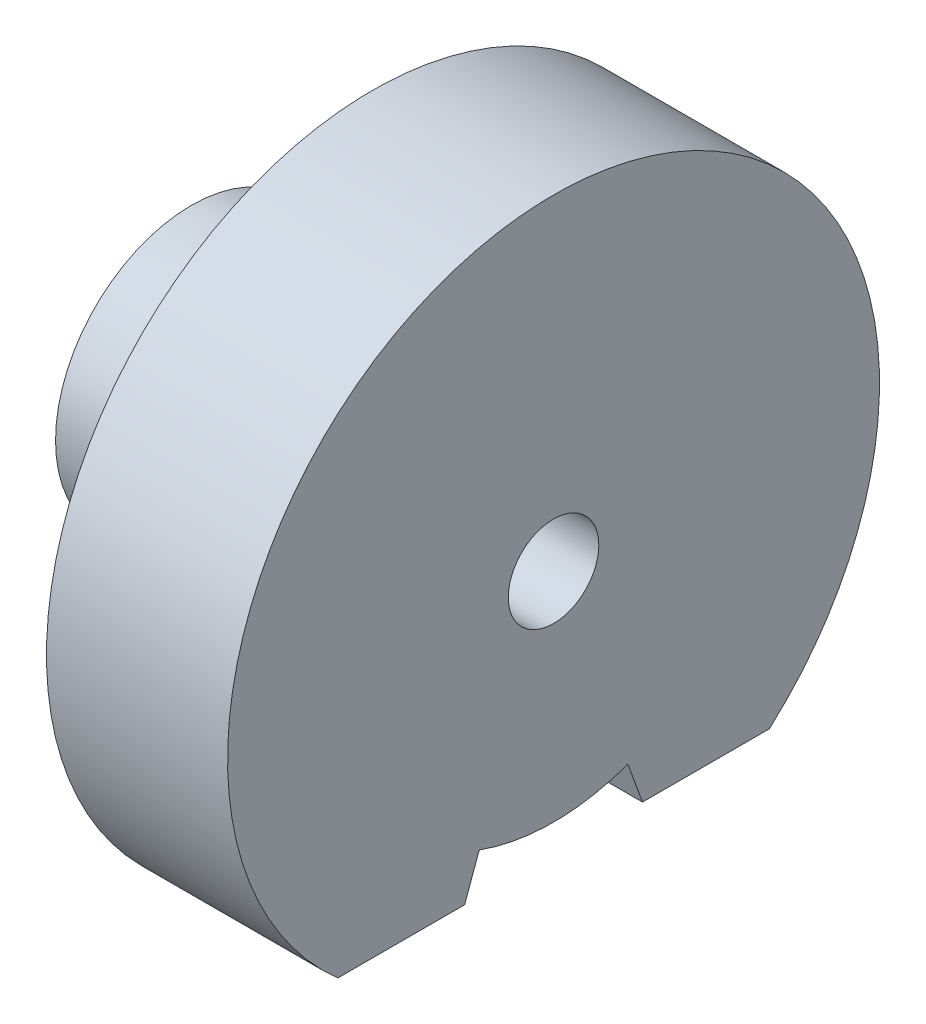
ISO-10303-21;
HEADER;
FILE_DESCRIPTION(('STEP AP214'),'2;1');
FILE_NAME('part.step','',(''),(''),'','','');
FILE_SCHEMA(('AUTOMOTIVE_DESIGN { 1 0 10303 214 1 1 1 1 }'));
ENDSEC;
DATA;
#1=APPLICATION_CONTEXT('core data for automotive mechanical design processes');
#2=APPLICATION_PROTOCOL_DEFINITION('international standard','automotive_design',2000,#1);
#3=PRODUCT_CONTEXT('',#1,'mechanical');
#4=PRODUCT('Part','Part','',(#3));
#5=PRODUCT_RELATED_PRODUCT_CATEGORY('part','',(#4));
#6=PRODUCT_DEFINITION_FORMATION('','',#4);
#7=PRODUCT_DEFINITION_CONTEXT('part definition',#1,'design');
#8=PRODUCT_DEFINITION('design','',#6,#7);
#9=PRODUCT_DEFINITION_SHAPE('','',#8);
#10=(LENGTH_UNIT() NAMED_UNIT(*) SI_UNIT(.MILLI.,.METRE.));
#11=(NAMED_UNIT(*) PLANE_ANGLE_UNIT() SI_UNIT($,.RADIAN.));
#12=(NAMED_UNIT(*) SI_UNIT($,.STERADIAN.) SOLID_ANGLE_UNIT());
#13=UNCERTAINTY_MEASURE_WITH_UNIT(LENGTH_MEASURE(1.E-05),#10,'distance_accuracy_value','');
#14=(GEOMETRIC_REPRESENTATION_CONTEXT(3) GLOBAL_UNCERTAINTY_ASSIGNED_CONTEXT((#13)) GLOBAL_UNIT_ASSIGNED_CONTEXT((#10,
#11,#12)) REPRESENTATION_CONTEXT('',''));
#15=CARTESIAN_POINT('',(0.,0.,0.));
#16=DIRECTION('',(0.,0.,1.));
#17=DIRECTION('',(1.,0.,0.));
#18=AXIS2_PLACEMENT_3D('',#15,#16,#17);
#19=CARTESIAN_POINT('',(-5.,0.,0.));
#20=DIRECTION('',(-1.,0.,0.));
#21=DIRECTION('',(0.,-1.,0.));
#22=AXIS2_PLACEMENT_3D('',#19,#20,#21);
#23=PLANE('',#22);
#24=CARTESIAN_POINT('',(-4.99999999999999,-12.,0.));
#25=DIRECTION('',(-1.,0.,0.));
#26=DIRECTION('',(0.,-1.,0.));
#27=AXIS2_PLACEMENT_3D('',#24,#25,#26);
#28=CIRCLE('',#27,9.5);
#29=CARTESIAN_POINT('',(-4.99999999999999,-21.5,0.));
#30=VERTEX_POINT('',#29);
#31=EDGE_CURVE('E11',#30,#30,#28,.F.);
#32=ORIENTED_EDGE('',*,*,#31,.T.);
#33=EDGE_LOOP('',(#32));
#34=FACE_BOUND('',#33,.T.);
#35=DIRECTION('',(0.,-0.939692620785911,0.342020143325661));
#36=VECTOR('',#35,1.);
#37=CARTESIAN_POINT('',(-5.,-23.276311449431,4.10424171990794));
#38=LINE('',#37,#36);
#39=CARTESIAN_POINT('',(-5.,-23.2763114494309,4.10424171990793));
#40=VERTEX_POINT('',#39);
#41=CARTESIAN_POINT('',(-4.99999999999999,-25.4942657408898,4.91151106296191));
#42=VERTEX_POINT('',#41);
#43=EDGE_CURVE('E123',#40,#42,#38,.T.);
#44=ORIENTED_EDGE('',*,*,#43,.T.);
#45=DIRECTION('',(0.,0.,-1.));
#46=VECTOR('',#45,1.);
#47=CARTESIAN_POINT('',(-4.99999999999999,-25.4942657408898,1.389771851223E-13));
#48=LINE('',#47,#46);
#49=CARTESIAN_POINT('',(-4.99999999999998,-25.4942657408897,11.912379783832));
#50=VERTEX_POINT('',#49);
#51=EDGE_CURVE('E167',#42,#50,#48,.F.);
#52=ORIENTED_EDGE('',*,*,#51,.T.);
#53=CARTESIAN_POINT('',(-4.99999999999998,-12.,0.));
#54=DIRECTION('',(1.,0.,0.));
#55=DIRECTION('',(0.,1.,0.));
#56=AXIS2_PLACEMENT_3D('',#53,#54,#55);
#57=CIRCLE('',#56,18.);
#58=CARTESIAN_POINT('',(-4.99999999999998,-25.4942657408898,-11.912379783832));
#59=VERTEX_POINT('',#58);
#60=EDGE_CURVE('E143',#59,#50,#57,.T.);
#61=ORIENTED_EDGE('',*,*,#60,.F.);
#62=DIRECTION('',(0.,0.,-1.));
#63=VECTOR('',#62,1.);
#64=CARTESIAN_POINT('',(-4.99999999999999,-25.4942657408898,-1.389771851223E-13));
#65=LINE('',#64,#63);
#66=CARTESIAN_POINT('',(-4.99999999999999,-25.4942657408898,-4.91151106296191));
#67=VERTEX_POINT('',#66);
#68=EDGE_CURVE('E160',#59,#67,#65,.F.);
#69=ORIENTED_EDGE('',*,*,#68,.T.);
#70=DIRECTION('',(0.,-0.939692620785911,-0.342020143325661));
#71=VECTOR('',#70,1.);
#72=CARTESIAN_POINT('',(-5.,-23.276311449431,-4.10424171990794));
#73=LINE('',#72,#71);
#74=CARTESIAN_POINT('',(-5.,-23.2763114494309,-4.10424171990793));
#75=VERTEX_POINT('',#74);
#76=EDGE_CURVE('E137',#75,#67,#73,.T.);
#77=ORIENTED_EDGE('',*,*,#76,.F.);
#78=CARTESIAN_POINT('',(-5.,-12.,0.));
#79=DIRECTION('',(1.,0.,0.));
#80=DIRECTION('',(0.,1.,0.));
#81=AXIS2_PLACEMENT_3D('',#78,#79,#80);
#82=CIRCLE('',#81,12.);
#83=EDGE_CURVE('E112',#40,#75,#82,.T.);
#84=ORIENTED_EDGE('',*,*,#83,.F.);
#85=EDGE_LOOP('',(#44,#52,#61,#69,#77,#84));
#86=FACE_BOUND('',#85,.T.);
#87=ADVANCED_FACE('F37',(#34,#86),#23,.T.);
#88=CARTESIAN_POINT('',(5.00000000000001,-12.,0.));
#89=DIRECTION('',(1.,0.,0.));
#90=DIRECTION('',(0.,1.,0.));
#91=AXIS2_PLACEMENT_3D('',#88,#89,#90);
#92=CYLINDRICAL_SURFACE('',#91,12.);
#93=ORIENTED_EDGE('',*,*,#83,.T.);
#94=DIRECTION('',(-1.,0.,0.));
#95=VECTOR('',#94,1.);
#96=CARTESIAN_POINT('',(0.,-23.2763114494309,-4.10424171990793));
#97=LINE('',#96,#95);
#98=CARTESIAN_POINT('',(-1.99999999999999,-23.2763114494309,-4.10424171990793));
#99=VERTEX_POINT('',#98);
#100=EDGE_CURVE('E140',#99,#75,#97,.T.);
#101=ORIENTED_EDGE('',*,*,#100,.F.);
#102=CARTESIAN_POINT('',(-2.,-12.,0.));
#103=DIRECTION('',(1.,0.,0.));
#104=DIRECTION('',(0.,1.,0.));
#105=AXIS2_PLACEMENT_3D('',#102,#103,#104);
#106=CIRCLE('',#105,12.);
#107=CARTESIAN_POINT('',(-1.99999999999999,-23.2763114494309,4.10424171990793));
#108=VERTEX_POINT('',#107);
#109=EDGE_CURVE('E150',#108,#99,#106,.T.);
#110=ORIENTED_EDGE('',*,*,#109,.F.);
#111=DIRECTION('',(-1.,0.,0.));
#112=VECTOR('',#111,1.);
#113=CARTESIAN_POINT('',(0.,-23.2763114494309,4.10424171990793));
#114=LINE('',#113,#112);
#115=EDGE_CURVE('E125',#108,#40,#114,.T.);
#116=ORIENTED_EDGE('',*,*,#115,.T.);
#117=EDGE_LOOP('',(#93,#101,#110,#116));
#118=FACE_BOUND('',#117,.T.);
#119=ADVANCED_FACE('F183',(#118),#92,.T.);
#120=CARTESIAN_POINT('',(5.00000000000001,-12.,0.));
#121=DIRECTION('',(1.,0.,0.));
#122=DIRECTION('',(0.,1.,0.));
#123=AXIS2_PLACEMENT_3D('',#120,#121,#122);
#124=CYLINDRICAL_SURFACE('',#123,12.);
#125=CARTESIAN_POINT('',(2.,-12.,0.));
#126=DIRECTION('',(1.,0.,0.));
#127=DIRECTION('',(0.,1.,0.));
#128=AXIS2_PLACEMENT_3D('',#125,#126,#127);
#129=CIRCLE('',#128,12.);
#130=CARTESIAN_POINT('',(2.00000000000001,-23.2763114494309,4.10424171990793));
#131=VERTEX_POINT('',#130);
#132=CARTESIAN_POINT('',(2.00000000000001,-23.2763114494309,-4.10424171990793));
#133=VERTEX_POINT('',#132);
#134=EDGE_CURVE('E113',#131,#133,#129,.T.);
#135=ORIENTED_EDGE('',*,*,#134,.T.);
#136=DIRECTION('',(-1.,0.,0.));
#137=VECTOR('',#136,1.);
#138=CARTESIAN_POINT('',(0.,-23.2763114494309,-4.10424171990793));
#139=LINE('',#138,#137);
#140=CARTESIAN_POINT('',(5.00000000000001,-23.2763114494309,-4.10424171990793));
#141=VERTEX_POINT('',#140);
#142=EDGE_CURVE('E109',#141,#133,#139,.T.);
#143=ORIENTED_EDGE('',*,*,#142,.F.);
#144=CARTESIAN_POINT('',(5.00000000000001,-12.,0.));
#145=DIRECTION('',(1.,0.,0.));
#146=DIRECTION('',(0.,1.,0.));
#147=AXIS2_PLACEMENT_3D('',#144,#145,#146);
#148=CIRCLE('',#147,12.);
#149=CARTESIAN_POINT('',(5.00000000000001,-23.2763114494309,4.10424171990793));
#150=VERTEX_POINT('',#149);
#151=EDGE_CURVE('E103',#150,#141,#148,.T.);
#152=ORIENTED_EDGE('',*,*,#151,.F.);
#153=DIRECTION('',(-1.,0.,0.));
#154=VECTOR('',#153,1.);
#155=CARTESIAN_POINT('',(0.,-23.2763114494309,4.10424171990793));
#156=LINE('',#155,#154);
#157=EDGE_CURVE('E106',#150,#131,#156,.T.);
#158=ORIENTED_EDGE('',*,*,#157,.T.);
#159=EDGE_LOOP('',(#135,#143,#152,#158));
#160=FACE_BOUND('',#159,.T.);
#161=ADVANCED_FACE('F105',(#160),#124,.T.);
#162=CARTESIAN_POINT('',(0.,-12.,0.));
#163=DIRECTION('',(1.,0.,0.));
#164=DIRECTION('',(0.,1.,0.));
#165=AXIS2_PLACEMENT_3D('',#162,#163,#164);
#166=TOROIDAL_SURFACE('',#165,12.,2.);
#167=ORIENTED_EDGE('',*,*,#109,.T.);
#168=CARTESIAN_POINT('',(0.,-23.2763114494309,-4.10424171990793));
#169=DIRECTION('',(0.,0.342020143325661,-0.939692620785911));
#170=DIRECTION('',(1.,0.,0.));
#171=AXIS2_PLACEMENT_3D('',#168,#169,#170);
#172=CIRCLE('',#171,2.);
#173=EDGE_CURVE('E131',#133,#99,#172,.T.);
#174=ORIENTED_EDGE('',*,*,#173,.F.);
#175=ORIENTED_EDGE('',*,*,#134,.F.);
#176=CARTESIAN_POINT('',(0.,-23.2763114494309,4.10424171990793));
#177=DIRECTION('',(0.,-0.342020143325661,-0.939692620785911));
#178=DIRECTION('',(1.,0.,0.));
#179=AXIS2_PLACEMENT_3D('',#176,#177,#178);
#180=CIRCLE('',#179,2.);
#181=EDGE_CURVE('E120',#131,#108,#180,.T.);
#182=ORIENTED_EDGE('',*,*,#181,.T.);
#183=EDGE_LOOP('',(#167,#174,#175,#182));
#184=FACE_BOUND('',#183,.T.);
#185=ADVANCED_FACE('F195',(#184),#166,.F.);
#186=CARTESIAN_POINT('',(5.00000000000001,0.,0.));
#187=DIRECTION('',(-1.,0.,0.));
#188=DIRECTION('',(0.,-1.,0.));
#189=AXIS2_PLACEMENT_3D('',#186,#187,#188);
#190=PLANE('',#189);
#191=CARTESIAN_POINT('',(5.00000000000001,-12.,0.));
#192=DIRECTION('',(1.,0.,0.));
#193=DIRECTION('',(0.,0.,-1.));
#194=AXIS2_PLACEMENT_3D('',#191,#192,#193);
#195=CIRCLE('',#194,2.5);
#196=CARTESIAN_POINT('',(5.00000000000001,-12.,-2.5));
#197=VERTEX_POINT('',#196);
#198=EDGE_CURVE('E230',#197,#197,#195,.T.);
#199=ORIENTED_EDGE('',*,*,#198,.F.);
#200=EDGE_LOOP('',(#199));
#201=FACE_BOUND('',#200,.T.);
#202=CARTESIAN_POINT('',(4.99999999999999,-12.,0.));
#203=DIRECTION('',(1.,0.,0.));
#204=DIRECTION('',(0.,1.,0.));
#205=AXIS2_PLACEMENT_3D('',#202,#203,#204);
#206=CIRCLE('',#205,18.);
#207=CARTESIAN_POINT('',(5.,-25.4942657408897,-11.912379783832));
#208=VERTEX_POINT('',#207);
#209=CARTESIAN_POINT('',(5.,-25.4942657408897,11.912379783832));
#210=VERTEX_POINT('',#209);
#211=EDGE_CURVE('E146',#208,#210,#206,.T.);
#212=ORIENTED_EDGE('',*,*,#211,.T.);
#213=DIRECTION('',(0.,0.,1.));
#214=VECTOR('',#213,1.);
#215=CARTESIAN_POINT('',(5.00000000000002,-25.4942657408897,11.912379783832));
#216=LINE('',#215,#214);
#217=CARTESIAN_POINT('',(5.00000000000001,-25.4942657408898,4.91151106296191));
#218=VERTEX_POINT('',#217);
#219=EDGE_CURVE('E60',#210,#218,#216,.F.);
#220=ORIENTED_EDGE('',*,*,#219,.T.);
#221=DIRECTION('',(0.,-0.939692620785911,0.342020143325661));
#222=VECTOR('',#221,1.);
#223=CARTESIAN_POINT('',(5.00000000000001,-23.276311449431,4.10424171990794));
#224=LINE('',#223,#222);
#225=EDGE_CURVE('E117',#150,#218,#224,.T.);
#226=ORIENTED_EDGE('',*,*,#225,.F.);
#227=ORIENTED_EDGE('',*,*,#151,.T.);
#228=DIRECTION('',(0.,-0.939692620785911,-0.342020143325661));
#229=VECTOR('',#228,1.);
#230=CARTESIAN_POINT('',(5.00000000000001,-23.2763114494309,-4.10424171990794));
#231=LINE('',#230,#229);
#232=CARTESIAN_POINT('',(5.00000000000001,-25.4942657408898,-4.91151106296192));
#233=VERTEX_POINT('',#232);
#234=EDGE_CURVE('E135',#141,#233,#231,.T.);
#235=ORIENTED_EDGE('',*,*,#234,.T.);
#236=DIRECTION('',(0.,0.,1.));
#237=VECTOR('',#236,1.);
#238=CARTESIAN_POINT('',(5.00000000000002,-25.4942657408898,-4.91151106296192));
#239=LINE('',#238,#237);
#240=EDGE_CURVE('E156',#233,#208,#239,.F.);
#241=ORIENTED_EDGE('',*,*,#240,.T.);
#242=EDGE_LOOP('',(#212,#220,#226,#227,#235,#241));
#243=FACE_BOUND('',#242,.T.);
#244=ADVANCED_FACE('F122',(#201,#243),#190,.F.);
#245=CARTESIAN_POINT('',(5.00000000000001,-12.,0.));
#246=DIRECTION('',(1.,0.,0.));
#247=DIRECTION('',(0.,1.,0.));
#248=AXIS2_PLACEMENT_3D('',#245,#246,#247);
#249=CYLINDRICAL_SURFACE('',#248,18.);
#250=ORIENTED_EDGE('',*,*,#60,.T.);
#251=DIRECTION('',(1.,0.,0.));
#252=VECTOR('',#251,1.);
#253=CARTESIAN_POINT('',(5.00000000000002,-25.4942657408897,11.912379783832));
#254=LINE('',#253,#252);
#255=EDGE_CURVE('E162',#50,#210,#254,.T.);
#256=ORIENTED_EDGE('',*,*,#255,.T.);
#257=ORIENTED_EDGE('',*,*,#211,.F.);
#258=DIRECTION('',(1.,0.,0.));
#259=VECTOR('',#258,1.);
#260=CARTESIAN_POINT('',(5.00000000000002,-25.4942657408897,-11.912379783832));
#261=LINE('',#260,#259);
#262=EDGE_CURVE('E158',#208,#59,#261,.F.);
#263=ORIENTED_EDGE('',*,*,#262,.T.);
#264=EDGE_LOOP('',(#250,#256,#257,#263));
#265=FACE_BOUND('',#264,.T.);
#266=ADVANCED_FACE('F222',(#265),#249,.T.);
#267=CARTESIAN_POINT('',(0.,-23.2763114494309,-4.10424171990793));
#268=DIRECTION('',(0.,0.342020143325661,-0.939692620785911));
#269=DIRECTION('',(1.,0.,0.));
#270=AXIS2_PLACEMENT_3D('',#267,#268,#269);
#271=PLANE('',#270);
#272=ORIENTED_EDGE('',*,*,#76,.T.);
#273=DIRECTION('',(1.,0.,0.));
#274=VECTOR('',#273,1.);
#275=CARTESIAN_POINT('',(0.,-25.4942657408898,-4.91151106296192));
#276=LINE('',#275,#274);
#277=EDGE_CURVE('E153',#67,#233,#276,.T.);
#278=ORIENTED_EDGE('',*,*,#277,.T.);
#279=ORIENTED_EDGE('',*,*,#234,.F.);
#280=ORIENTED_EDGE('',*,*,#142,.T.);
#281=ORIENTED_EDGE('',*,*,#173,.T.);
#282=ORIENTED_EDGE('',*,*,#100,.T.);
#283=EDGE_LOOP('',(#272,#278,#279,#280,#281,#282));
#284=FACE_BOUND('',#283,.T.);
#285=ADVANCED_FACE('F228',(#284),#271,.F.);
#286=CARTESIAN_POINT('',(0.,-23.2763114494309,4.10424171990793));
#287=DIRECTION('',(0.,-0.342020143325661,-0.939692620785911));
#288=DIRECTION('',(1.,0.,0.));
#289=AXIS2_PLACEMENT_3D('',#286,#287,#288);
#290=PLANE('',#289);
#291=ORIENTED_EDGE('',*,*,#225,.T.);
#292=DIRECTION('',(-1.,0.,0.));
#293=VECTOR('',#292,1.);
#294=CARTESIAN_POINT('',(-4.99999999999998,-25.4942657408898,4.91151106296191));
#295=LINE('',#294,#293);
#296=EDGE_CURVE('E52',#218,#42,#295,.T.);
#297=ORIENTED_EDGE('',*,*,#296,.T.);
#298=ORIENTED_EDGE('',*,*,#43,.F.);
#299=ORIENTED_EDGE('',*,*,#115,.F.);
#300=ORIENTED_EDGE('',*,*,#181,.F.);
#301=ORIENTED_EDGE('',*,*,#157,.F.);
#302=EDGE_LOOP('',(#291,#297,#298,#299,#300,#301));
#303=FACE_BOUND('',#302,.T.);
#304=ADVANCED_FACE('F116',(#303),#290,.T.);
#305=CARTESIAN_POINT('',(5.00000000000002,-25.4942657408898,-4.91151106296192));
#306=DIRECTION('',(0.,1.,0.));
#307=DIRECTION('',(1.,0.,0.));
#308=AXIS2_PLACEMENT_3D('',#305,#306,#307);
#309=PLANE('',#308);
#310=ORIENTED_EDGE('',*,*,#68,.F.);
#311=ORIENTED_EDGE('',*,*,#262,.F.);
#312=ORIENTED_EDGE('',*,*,#240,.F.);
#313=ORIENTED_EDGE('',*,*,#277,.F.);
#314=EDGE_LOOP('',(#310,#311,#312,#313));
#315=FACE_BOUND('',#314,.T.);
#316=ADVANCED_FACE('F200',(#315),#309,.F.);
#317=CARTESIAN_POINT('',(5.00000000000002,-25.4942657408897,11.912379783832));
#318=DIRECTION('',(0.,1.,0.));
#319=DIRECTION('',(1.,0.,0.));
#320=AXIS2_PLACEMENT_3D('',#317,#318,#319);
#321=PLANE('',#320);
#322=ORIENTED_EDGE('',*,*,#51,.F.);
#323=ORIENTED_EDGE('',*,*,#296,.F.);
#324=ORIENTED_EDGE('',*,*,#219,.F.);
#325=ORIENTED_EDGE('',*,*,#255,.F.);
#326=EDGE_LOOP('',(#322,#323,#324,#325));
#327=FACE_BOUND('',#326,.T.);
#328=ADVANCED_FACE('F205',(#327),#321,.F.);
#329=CARTESIAN_POINT('',(-4.99999999999999,-12.,0.));
#330=DIRECTION('',(1.,0.,0.));
#331=DIRECTION('',(0.,0.,-1.));
#332=AXIS2_PLACEMENT_3D('',#329,#330,#331);
#333=CYLINDRICAL_SURFACE('',#332,2.5);
#334=ORIENTED_EDGE('',*,*,#198,.T.);
#335=EDGE_LOOP('',(#334));
#336=FACE_BOUND('',#335,.T.);
#337=CARTESIAN_POINT('',(-15.,-12.,0.));
#338=DIRECTION('',(-1.,0.,0.));
#339=DIRECTION('',(0.,0.,1.));
#340=AXIS2_PLACEMENT_3D('',#337,#338,#339);
#341=CIRCLE('',#340,2.5);
#342=CARTESIAN_POINT('',(-15.,-12.,2.5));
#343=VERTEX_POINT('',#342);
#344=EDGE_CURVE('E237',#343,#343,#341,.T.);
#345=ORIENTED_EDGE('',*,*,#344,.T.);
#346=EDGE_LOOP('',(#345));
#347=FACE_BOUND('',#346,.T.);
#348=ADVANCED_FACE('F210',(#336,#347),#333,.F.);
#349=CARTESIAN_POINT('',(-15.,-12.,0.));
#350=DIRECTION('',(-1.,0.,0.));
#351=DIRECTION('',(0.,0.,1.));
#352=AXIS2_PLACEMENT_3D('',#349,#350,#351);
#353=PLANE('',#352);
#354=CARTESIAN_POINT('',(-15.,-12.,0.));
#355=DIRECTION('',(-1.,0.,0.));
#356=DIRECTION('',(0.,0.,1.));
#357=AXIS2_PLACEMENT_3D('',#354,#355,#356);
#358=CIRCLE('',#357,7.5);
#359=CARTESIAN_POINT('',(-15.,-12.,7.5));
#360=VERTEX_POINT('',#359);
#361=EDGE_CURVE('E232',#360,#360,#358,.T.);
#362=ORIENTED_EDGE('',*,*,#361,.T.);
#363=EDGE_LOOP('',(#362));
#364=FACE_BOUND('',#363,.T.);
#365=ORIENTED_EDGE('',*,*,#344,.F.);
#366=EDGE_LOOP('',(#365));
#367=FACE_BOUND('',#366,.T.);
#368=ADVANCED_FACE('F179',(#364,#367),#353,.T.);
#369=CARTESIAN_POINT('',(-15.,-12.,0.));
#370=DIRECTION('',(1.,0.,0.));
#371=DIRECTION('',(0.,0.,-1.));
#372=AXIS2_PLACEMENT_3D('',#369,#370,#371);
#373=CYLINDRICAL_SURFACE('',#372,7.5);
#374=CARTESIAN_POINT('',(-7.,-12.,0.));
#375=DIRECTION('',(-1.,0.,0.));
#376=DIRECTION('',(0.,-1.,0.));
#377=AXIS2_PLACEMENT_3D('',#374,#375,#376);
#378=CIRCLE('',#377,7.5);
#379=CARTESIAN_POINT('',(-6.99999999999999,-19.5,0.));
#380=VERTEX_POINT('',#379);
#381=EDGE_CURVE('E45',#380,#380,#378,.T.);
#382=ORIENTED_EDGE('',*,*,#381,.T.);
#383=EDGE_LOOP('',(#382));
#384=FACE_BOUND('',#383,.T.);
#385=ORIENTED_EDGE('',*,*,#361,.F.);
#386=EDGE_LOOP('',(#385));
#387=FACE_BOUND('',#386,.T.);
#388=ADVANCED_FACE('F171',(#384,#387),#373,.T.);
#389=CARTESIAN_POINT('',(-7.,-12.,0.));
#390=DIRECTION('',(-1.,0.,0.));
#391=DIRECTION('',(0.,-1.,0.));
#392=AXIS2_PLACEMENT_3D('',#389,#390,#391);
#393=TOROIDAL_SURFACE('',#392,9.5,2.);
#394=ORIENTED_EDGE('',*,*,#31,.F.);
#395=EDGE_LOOP('',(#394));
#396=FACE_BOUND('',#395,.T.);
#397=ORIENTED_EDGE('',*,*,#381,.F.);
#398=EDGE_LOOP('',(#397));
#399=FACE_BOUND('',#398,.T.);
#400=ADVANCED_FACE('F39',(#396,#399),#393,.F.);
#401=CLOSED_SHELL('',(#87,#119,#161,#185,#244,#266,#285,#304,#316,#328,#348,#368,#388,#400));
#402=MANIFOLD_SOLID_BREP('B2',#401);
#403=ADVANCED_BREP_SHAPE_REPRESENTATION('',(#18,#402),#14);
#404=SHAPE_DEFINITION_REPRESENTATION(#9,#403);
ENDSEC;
END-ISO-10303-21;
